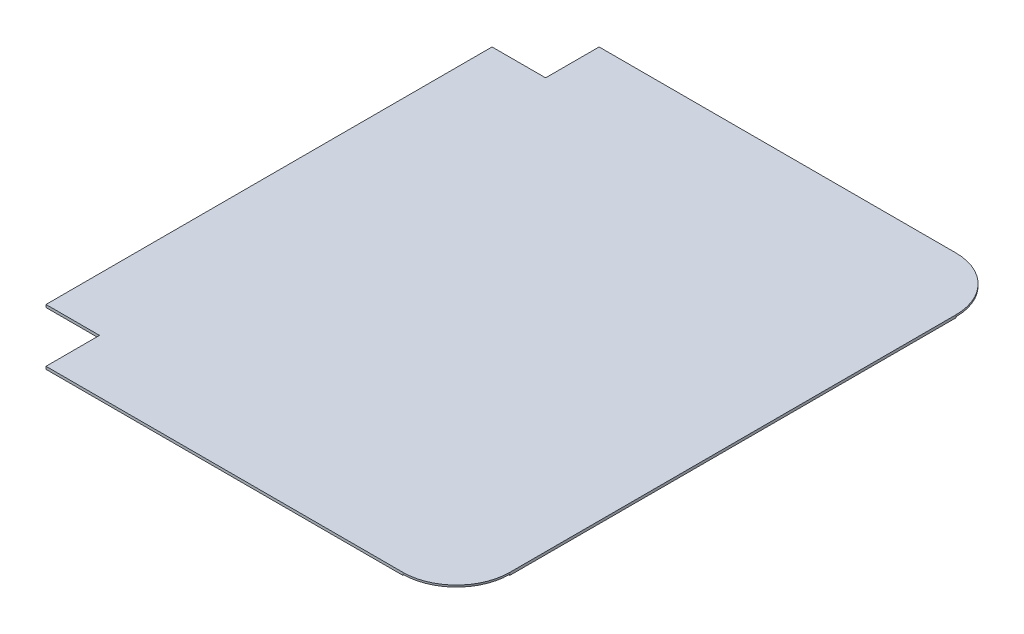
ISO-10303-21;
HEADER;
FILE_DESCRIPTION(('STEP AP214'),'2;1');
FILE_NAME('part.step','',(''),(''),'','','');
FILE_SCHEMA(('AUTOMOTIVE_DESIGN { 1 0 10303 214 1 1 1 1 }'));
ENDSEC;
DATA;
#1=APPLICATION_CONTEXT('core data for automotive mechanical design processes');
#2=APPLICATION_PROTOCOL_DEFINITION('international standard','automotive_design',2000,#1);
#3=PRODUCT_CONTEXT('',#1,'mechanical');
#4=PRODUCT('Part','Part','',(#3));
#5=PRODUCT_RELATED_PRODUCT_CATEGORY('part','',(#4));
#6=PRODUCT_DEFINITION_FORMATION('','',#4);
#7=PRODUCT_DEFINITION_CONTEXT('part definition',#1,'design');
#8=PRODUCT_DEFINITION('design','',#6,#7);
#9=PRODUCT_DEFINITION_SHAPE('','',#8);
#10=(LENGTH_UNIT() NAMED_UNIT(*) SI_UNIT(.MILLI.,.METRE.));
#11=(NAMED_UNIT(*) PLANE_ANGLE_UNIT() SI_UNIT($,.RADIAN.));
#12=(NAMED_UNIT(*) SI_UNIT($,.STERADIAN.) SOLID_ANGLE_UNIT());
#13=UNCERTAINTY_MEASURE_WITH_UNIT(LENGTH_MEASURE(1.E-05),#10,'distance_accuracy_value','');
#14=(GEOMETRIC_REPRESENTATION_CONTEXT(3) GLOBAL_UNCERTAINTY_ASSIGNED_CONTEXT((#13)) GLOBAL_UNIT_ASSIGNED_CONTEXT((#10,
#11,#12)) REPRESENTATION_CONTEXT('',''));
#15=CARTESIAN_POINT('',(0.,0.,0.));
#16=DIRECTION('',(0.,0.,1.));
#17=DIRECTION('',(1.,0.,0.));
#18=AXIS2_PLACEMENT_3D('',#15,#16,#17);
#19=CARTESIAN_POINT('',(159.082568807339,3.,196.788990825688));
#20=DIRECTION('',(-1.,0.,0.));
#21=DIRECTION('',(0.,0.,1.));
#22=AXIS2_PLACEMENT_3D('',#19,#20,#21);
#23=PLANE('',#22);
#24=DIRECTION('',(0.,0.,1.));
#25=VECTOR('',#24,1.);
#26=CARTESIAN_POINT('',(159.082568807339,1.,256.788990825689));
#27=LINE('',#26,#25);
#28=CARTESIAN_POINT('',(159.082568807339,1.,196.788990825689));
#29=VERTEX_POINT('',#28);
#30=CARTESIAN_POINT('',(159.082568807339,1.,256.788990825689));
#31=VERTEX_POINT('',#30);
#32=EDGE_CURVE('E251',#29,#31,#27,.T.);
#33=ORIENTED_EDGE('',*,*,#32,.T.);
#34=DIRECTION('',(0.,-1.,0.));
#35=VECTOR('',#34,1.);
#36=CARTESIAN_POINT('',(159.082568807339,3.,256.788990825688));
#37=LINE('',#36,#35);
#38=CARTESIAN_POINT('',(159.082568807339,0.,256.788990825688));
#39=VERTEX_POINT('',#38);
#40=EDGE_CURVE('E205',#31,#39,#37,.T.);
#41=ORIENTED_EDGE('',*,*,#40,.T.);
#42=DIRECTION('',(0.,0.,-1.));
#43=VECTOR('',#42,1.);
#44=CARTESIAN_POINT('',(159.082568807339,0.,196.788990825688));
#45=LINE('',#44,#43);
#46=CARTESIAN_POINT('',(159.082568807339,0.,196.788990825688));
#47=VERTEX_POINT('',#46);
#48=EDGE_CURVE('E170',#39,#47,#45,.T.);
#49=ORIENTED_EDGE('',*,*,#48,.T.);
#50=DIRECTION('',(0.,-1.,0.));
#51=VECTOR('',#50,1.);
#52=CARTESIAN_POINT('',(159.082568807339,3.,196.788990825688));
#53=LINE('',#52,#51);
#54=EDGE_CURVE('E203',#29,#47,#53,.T.);
#55=ORIENTED_EDGE('',*,*,#54,.F.);
#56=EDGE_LOOP('',(#33,#41,#49,#55));
#57=FACE_BOUND('',#56,.T.);
#58=ADVANCED_FACE('F49',(#57),#23,.F.);
#59=CARTESIAN_POINT('',(219.082568807339,3.,196.788990825688));
#60=DIRECTION('',(0.,0.,-1.));
#61=DIRECTION('',(-1.,0.,0.));
#62=AXIS2_PLACEMENT_3D('',#59,#60,#61);
#63=PLANE('',#62);
#64=DIRECTION('',(-1.,0.,0.));
#65=VECTOR('',#64,1.);
#66=CARTESIAN_POINT('',(159.082568807339,1.,196.788990825689));
#67=LINE('',#66,#65);
#68=CARTESIAN_POINT('',(219.082568807339,1.,196.788990825689));
#69=VERTEX_POINT('',#68);
#70=EDGE_CURVE('E248',#69,#29,#67,.T.);
#71=ORIENTED_EDGE('',*,*,#70,.T.);
#72=ORIENTED_EDGE('',*,*,#54,.T.);
#73=DIRECTION('',(1.,0.,0.));
#74=VECTOR('',#73,1.);
#75=CARTESIAN_POINT('',(219.082568807339,0.,196.788990825688));
#76=LINE('',#75,#74);
#77=CARTESIAN_POINT('',(219.082568807339,0.,196.788990825688));
#78=VERTEX_POINT('',#77);
#79=EDGE_CURVE('E173',#47,#78,#76,.T.);
#80=ORIENTED_EDGE('',*,*,#79,.T.);
#81=DIRECTION('',(0.,-1.,0.));
#82=VECTOR('',#81,1.);
#83=CARTESIAN_POINT('',(219.082568807339,3.,196.788990825688));
#84=LINE('',#83,#82);
#85=EDGE_CURVE('E199',#69,#78,#84,.T.);
#86=ORIENTED_EDGE('',*,*,#85,.F.);
#87=EDGE_LOOP('',(#71,#72,#80,#86));
#88=FACE_BOUND('',#87,.T.);
#89=ADVANCED_FACE('F304',(#88),#63,.F.);
#90=CARTESIAN_POINT('',(-300.917431192661,3.,-303.211009174312));
#91=DIRECTION('',(1.,0.,0.));
#92=DIRECTION('',(0.,0.,-1.));
#93=AXIS2_PLACEMENT_3D('',#90,#91,#92);
#94=PLANE('',#93);
#95=DIRECTION('',(0.,0.,1.));
#96=VECTOR('',#95,1.);
#97=CARTESIAN_POINT('',(-300.917431192661,0.,-303.211009174312));
#98=LINE('',#97,#96);
#99=CARTESIAN_POINT('',(-300.917431192661,0.,-303.211009174312));
#100=VERTEX_POINT('',#99);
#101=CARTESIAN_POINT('',(-300.917431192661,0.,196.788990825688));
#102=VERTEX_POINT('',#101);
#103=EDGE_CURVE('E159',#100,#102,#98,.T.);
#104=ORIENTED_EDGE('',*,*,#103,.T.);
#105=DIRECTION('',(0.,-1.,0.));
#106=VECTOR('',#105,1.);
#107=CARTESIAN_POINT('',(-300.917431192661,3.,196.788990825688));
#108=LINE('',#107,#106);
#109=CARTESIAN_POINT('',(-300.917431192661,3.,196.788990825688));
#110=VERTEX_POINT('',#109);
#111=EDGE_CURVE('E11',#110,#102,#108,.T.);
#112=ORIENTED_EDGE('',*,*,#111,.F.);
#113=DIRECTION('',(0.,0.,1.));
#114=VECTOR('',#113,1.);
#115=CARTESIAN_POINT('',(-300.917431192661,3.,-303.211009174312));
#116=LINE('',#115,#114);
#117=CARTESIAN_POINT('',(-300.917431192661,3.,-303.211009174312));
#118=VERTEX_POINT('',#117);
#119=EDGE_CURVE('E188',#118,#110,#116,.T.);
#120=ORIENTED_EDGE('',*,*,#119,.F.);
#121=DIRECTION('',(0.,-1.,0.));
#122=VECTOR('',#121,1.);
#123=CARTESIAN_POINT('',(-300.917431192661,3.,-303.211009174312));
#124=LINE('',#123,#122);
#125=EDGE_CURVE('E155',#118,#100,#124,.T.);
#126=ORIENTED_EDGE('',*,*,#125,.T.);
#127=EDGE_LOOP('',(#104,#112,#120,#126));
#128=FACE_BOUND('',#127,.T.);
#129=ADVANCED_FACE('F51',(#128),#94,.F.);
#130=CARTESIAN_POINT('',(-300.917431192661,3.,196.788990825688));
#131=DIRECTION('',(0.,0.,-1.));
#132=DIRECTION('',(-1.,0.,0.));
#133=AXIS2_PLACEMENT_3D('',#130,#131,#132);
#134=PLANE('',#133);
#135=DIRECTION('',(1.,0.,0.));
#136=VECTOR('',#135,1.);
#137=CARTESIAN_POINT('',(-300.917431192661,0.,196.788990825688));
#138=LINE('',#137,#136);
#139=CARTESIAN_POINT('',(-240.917431192661,0.,196.788990825688));
#140=VERTEX_POINT('',#139);
#141=EDGE_CURVE('E162',#102,#140,#138,.T.);
#142=ORIENTED_EDGE('',*,*,#141,.T.);
#143=DIRECTION('',(0.,-1.,0.));
#144=VECTOR('',#143,1.);
#145=CARTESIAN_POINT('',(-240.917431192661,3.,196.788990825688));
#146=LINE('',#145,#144);
#147=CARTESIAN_POINT('',(-240.917431192661,3.,196.788990825688));
#148=VERTEX_POINT('',#147);
#149=EDGE_CURVE('E58',#148,#140,#146,.T.);
#150=ORIENTED_EDGE('',*,*,#149,.F.);
#151=DIRECTION('',(1.,0.,0.));
#152=VECTOR('',#151,1.);
#153=CARTESIAN_POINT('',(-300.917431192661,3.,196.788990825688));
#154=LINE('',#153,#152);
#155=EDGE_CURVE('E122',#110,#148,#154,.T.);
#156=ORIENTED_EDGE('',*,*,#155,.F.);
#157=ORIENTED_EDGE('',*,*,#111,.T.);
#158=EDGE_LOOP('',(#142,#150,#156,#157));
#159=FACE_BOUND('',#158,.T.);
#160=ADVANCED_FACE('F332',(#159),#134,.F.);
#161=CARTESIAN_POINT('',(-240.917431192661,3.,196.788990825688));
#162=DIRECTION('',(1.,0.,0.));
#163=DIRECTION('',(0.,0.,-1.));
#164=AXIS2_PLACEMENT_3D('',#161,#162,#163);
#165=PLANE('',#164);
#166=DIRECTION('',(0.,0.,1.));
#167=VECTOR('',#166,1.);
#168=CARTESIAN_POINT('',(-240.917431192661,0.,196.788990825688));
#169=LINE('',#168,#167);
#170=CARTESIAN_POINT('',(-240.917431192661,0.,256.788990825688));
#171=VERTEX_POINT('',#170);
#172=EDGE_CURVE('E165',#140,#171,#169,.T.);
#173=ORIENTED_EDGE('',*,*,#172,.T.);
#174=DIRECTION('',(0.,-1.,0.));
#175=VECTOR('',#174,1.);
#176=CARTESIAN_POINT('',(-240.917431192661,3.,256.788990825688));
#177=LINE('',#176,#175);
#178=CARTESIAN_POINT('',(-240.917431192661,3.,256.788990825688));
#179=VERTEX_POINT('',#178);
#180=EDGE_CURVE('E209',#179,#171,#177,.T.);
#181=ORIENTED_EDGE('',*,*,#180,.F.);
#182=DIRECTION('',(0.,0.,1.));
#183=VECTOR('',#182,1.);
#184=CARTESIAN_POINT('',(-240.917431192661,3.,196.788990825688));
#185=LINE('',#184,#183);
#186=EDGE_CURVE('E217',#148,#179,#185,.T.);
#187=ORIENTED_EDGE('',*,*,#186,.F.);
#188=ORIENTED_EDGE('',*,*,#149,.T.);
#189=EDGE_LOOP('',(#173,#181,#187,#188));
#190=FACE_BOUND('',#189,.T.);
#191=ADVANCED_FACE('F215',(#190),#165,.F.);
#192=CARTESIAN_POINT('',(-240.917431192661,3.,256.788990825688));
#193=DIRECTION('',(0.,0.,-1.));
#194=DIRECTION('',(-1.,0.,0.));
#195=AXIS2_PLACEMENT_3D('',#192,#193,#194);
#196=PLANE('',#195);
#197=DIRECTION('',(1.,0.,0.));
#198=VECTOR('',#197,1.);
#199=CARTESIAN_POINT('',(-240.917431192661,0.,256.788990825688));
#200=LINE('',#199,#198);
#201=EDGE_CURVE('E167',#171,#39,#200,.T.);
#202=ORIENTED_EDGE('',*,*,#201,.T.);
#203=ORIENTED_EDGE('',*,*,#40,.F.);
#204=CARTESIAN_POINT('',(159.082568807339,3.,256.788990825689));
#205=VERTEX_POINT('',#204);
#206=EDGE_CURVE('E206',#205,#31,#37,.T.);
#207=ORIENTED_EDGE('',*,*,#206,.F.);
#208=DIRECTION('',(1.,0.,0.));
#209=VECTOR('',#208,1.);
#210=CARTESIAN_POINT('',(-240.917431192661,3.,256.788990825688));
#211=LINE('',#210,#209);
#212=EDGE_CURVE('E231',#179,#205,#211,.T.);
#213=ORIENTED_EDGE('',*,*,#212,.F.);
#214=ORIENTED_EDGE('',*,*,#180,.T.);
#215=EDGE_LOOP('',(#202,#203,#207,#213,#214));
#216=FACE_BOUND('',#215,.T.);
#217=ADVANCED_FACE('F226',(#216),#196,.F.);
#218=CARTESIAN_POINT('',(219.082568807339,3.,-303.211009174311));
#219=DIRECTION('',(-1.,0.,0.));
#220=DIRECTION('',(0.,0.,1.));
#221=AXIS2_PLACEMENT_3D('',#218,#219,#220);
#222=PLANE('',#221);
#223=DIRECTION('',(0.,0.,-1.));
#224=VECTOR('',#223,1.);
#225=CARTESIAN_POINT('',(219.082568807339,0.,-303.211009174311));
#226=LINE('',#225,#224);
#227=CARTESIAN_POINT('',(219.082568807339,0.,-303.211009174311));
#228=VERTEX_POINT('',#227);
#229=EDGE_CURVE('E176',#78,#228,#226,.T.);
#230=ORIENTED_EDGE('',*,*,#229,.T.);
#231=DIRECTION('',(0.,-1.,0.));
#232=VECTOR('',#231,1.);
#233=CARTESIAN_POINT('',(219.082568807339,3.,-303.211009174311));
#234=LINE('',#233,#232);
#235=CARTESIAN_POINT('',(219.082568807339,1.,-303.211009174312));
#236=VERTEX_POINT('',#235);
#237=EDGE_CURVE('E195',#236,#228,#234,.T.);
#238=ORIENTED_EDGE('',*,*,#237,.F.);
#239=CARTESIAN_POINT('',(219.082568807339,3.,-303.211009174312));
#240=VERTEX_POINT('',#239);
#241=EDGE_CURVE('E196',#240,#236,#234,.T.);
#242=ORIENTED_EDGE('',*,*,#241,.F.);
#243=DIRECTION('',(0.,0.,-1.));
#244=VECTOR('',#243,1.);
#245=CARTESIAN_POINT('',(219.082568807339,3.,-303.211009174311));
#246=LINE('',#245,#244);
#247=CARTESIAN_POINT('',(219.082568807339,3.,196.788990825689));
#248=VERTEX_POINT('',#247);
#249=EDGE_CURVE('E144',#248,#240,#246,.T.);
#250=ORIENTED_EDGE('',*,*,#249,.F.);
#251=EDGE_CURVE('E200',#248,#69,#84,.T.);
#252=ORIENTED_EDGE('',*,*,#251,.T.);
#253=ORIENTED_EDGE('',*,*,#85,.T.);
#254=EDGE_LOOP('',(#230,#238,#242,#250,#252,#253));
#255=FACE_BOUND('',#254,.T.);
#256=ADVANCED_FACE('F267',(#255),#222,.F.);
#257=CARTESIAN_POINT('',(159.082568807339,3.,-303.211009174312));
#258=DIRECTION('',(0.,0.,1.));
#259=DIRECTION('',(1.,0.,0.));
#260=AXIS2_PLACEMENT_3D('',#257,#258,#259);
#261=PLANE('',#260);
#262=DIRECTION('',(0.,-1.,0.));
#263=VECTOR('',#262,1.);
#264=CARTESIAN_POINT('',(159.082568807339,3.,-303.211009174312));
#265=LINE('',#264,#263);
#266=CARTESIAN_POINT('',(159.082568807339,1.,-303.211009174312));
#267=VERTEX_POINT('',#266);
#268=CARTESIAN_POINT('',(159.082568807339,0.,-303.211009174312));
#269=VERTEX_POINT('',#268);
#270=EDGE_CURVE('E193',#267,#269,#265,.T.);
#271=ORIENTED_EDGE('',*,*,#270,.F.);
#272=DIRECTION('',(1.,0.,0.));
#273=VECTOR('',#272,1.);
#274=CARTESIAN_POINT('',(159.082568807339,1.,-303.211009174312));
#275=LINE('',#274,#273);
#276=EDGE_CURVE('E243',#267,#236,#275,.T.);
#277=ORIENTED_EDGE('',*,*,#276,.T.);
#278=ORIENTED_EDGE('',*,*,#237,.T.);
#279=DIRECTION('',(-1.,0.,0.));
#280=VECTOR('',#279,1.);
#281=CARTESIAN_POINT('',(159.082568807339,0.,-303.211009174312));
#282=LINE('',#281,#280);
#283=EDGE_CURVE('E179',#228,#269,#282,.T.);
#284=ORIENTED_EDGE('',*,*,#283,.T.);
#285=EDGE_LOOP('',(#271,#277,#278,#284));
#286=FACE_BOUND('',#285,.T.);
#287=ADVANCED_FACE('F284',(#286),#261,.F.);
#288=CARTESIAN_POINT('',(159.082568807339,3.,-363.211009174312));
#289=DIRECTION('',(-1.,0.,0.));
#290=DIRECTION('',(0.,0.,1.));
#291=AXIS2_PLACEMENT_3D('',#288,#289,#290);
#292=PLANE('',#291);
#293=DIRECTION('',(0.,-1.,0.));
#294=VECTOR('',#293,1.);
#295=CARTESIAN_POINT('',(159.082568807339,3.,-363.211009174312));
#296=LINE('',#295,#294);
#297=CARTESIAN_POINT('',(159.082568807339,1.,-363.211009174312));
#298=VERTEX_POINT('',#297);
#299=CARTESIAN_POINT('',(159.082568807339,0.,-363.211009174312));
#300=VERTEX_POINT('',#299);
#301=EDGE_CURVE('E150',#298,#300,#296,.T.);
#302=ORIENTED_EDGE('',*,*,#301,.F.);
#303=DIRECTION('',(0.,0.,1.));
#304=VECTOR('',#303,1.);
#305=CARTESIAN_POINT('',(159.082568807339,1.,-363.211009174312));
#306=LINE('',#305,#304);
#307=EDGE_CURVE('E239',#298,#267,#306,.T.);
#308=ORIENTED_EDGE('',*,*,#307,.T.);
#309=ORIENTED_EDGE('',*,*,#270,.T.);
#310=DIRECTION('',(0.,0.,-1.));
#311=VECTOR('',#310,1.);
#312=CARTESIAN_POINT('',(159.082568807339,0.,-363.211009174312));
#313=LINE('',#312,#311);
#314=EDGE_CURVE('E182',#269,#300,#313,.T.);
#315=ORIENTED_EDGE('',*,*,#314,.T.);
#316=EDGE_LOOP('',(#302,#308,#309,#315));
#317=FACE_BOUND('',#316,.T.);
#318=ADVANCED_FACE('F289',(#317),#292,.F.);
#319=CARTESIAN_POINT('',(-240.917431192661,3.,-363.211009174312));
#320=DIRECTION('',(0.,0.,1.));
#321=DIRECTION('',(1.,0.,0.));
#322=AXIS2_PLACEMENT_3D('',#319,#320,#321);
#323=PLANE('',#322);
#324=DIRECTION('',(-1.,0.,0.));
#325=VECTOR('',#324,1.);
#326=CARTESIAN_POINT('',(-240.917431192661,0.,-363.211009174312));
#327=LINE('',#326,#325);
#328=CARTESIAN_POINT('',(-240.917431192661,0.,-363.211009174312));
#329=VERTEX_POINT('',#328);
#330=EDGE_CURVE('E149',#300,#329,#327,.T.);
#331=ORIENTED_EDGE('',*,*,#330,.T.);
#332=DIRECTION('',(0.,-1.,0.));
#333=VECTOR('',#332,1.);
#334=CARTESIAN_POINT('',(-240.917431192661,3.,-363.211009174312));
#335=LINE('',#334,#333);
#336=CARTESIAN_POINT('',(-240.917431192661,3.,-363.211009174312));
#337=VERTEX_POINT('',#336);
#338=EDGE_CURVE('E146',#337,#329,#335,.T.);
#339=ORIENTED_EDGE('',*,*,#338,.F.);
#340=DIRECTION('',(-1.,0.,0.));
#341=VECTOR('',#340,1.);
#342=CARTESIAN_POINT('',(-240.917431192661,3.,-363.211009174312));
#343=LINE('',#342,#341);
#344=CARTESIAN_POINT('',(159.082568807339,3.,-363.211009174312));
#345=VERTEX_POINT('',#344);
#346=EDGE_CURVE('E133',#345,#337,#343,.T.);
#347=ORIENTED_EDGE('',*,*,#346,.F.);
#348=EDGE_CURVE('E191',#345,#298,#296,.T.);
#349=ORIENTED_EDGE('',*,*,#348,.T.);
#350=ORIENTED_EDGE('',*,*,#301,.T.);
#351=EDGE_LOOP('',(#331,#339,#347,#349,#350));
#352=FACE_BOUND('',#351,.T.);
#353=ADVANCED_FACE('F147',(#352),#323,.F.);
#354=CARTESIAN_POINT('',(-240.917431192661,3.,-363.211009174312));
#355=DIRECTION('',(1.,0.,0.));
#356=DIRECTION('',(0.,0.,-1.));
#357=AXIS2_PLACEMENT_3D('',#354,#355,#356);
#358=PLANE('',#357);
#359=DIRECTION('',(0.,0.,1.));
#360=VECTOR('',#359,1.);
#361=CARTESIAN_POINT('',(-240.917431192661,0.,-363.211009174312));
#362=LINE('',#361,#360);
#363=CARTESIAN_POINT('',(-240.917431192661,0.,-303.211009174312));
#364=VERTEX_POINT('',#363);
#365=EDGE_CURVE('E108',#329,#364,#362,.T.);
#366=ORIENTED_EDGE('',*,*,#365,.T.);
#367=DIRECTION('',(0.,-1.,0.));
#368=VECTOR('',#367,1.);
#369=CARTESIAN_POINT('',(-240.917431192661,3.,-303.211009174312));
#370=LINE('',#369,#368);
#371=CARTESIAN_POINT('',(-240.917431192661,3.,-303.211009174312));
#372=VERTEX_POINT('',#371);
#373=EDGE_CURVE('E151',#372,#364,#370,.T.);
#374=ORIENTED_EDGE('',*,*,#373,.F.);
#375=DIRECTION('',(0.,0.,1.));
#376=VECTOR('',#375,1.);
#377=CARTESIAN_POINT('',(-240.917431192661,3.,-363.211009174312));
#378=LINE('',#377,#376);
#379=EDGE_CURVE('E138',#337,#372,#378,.T.);
#380=ORIENTED_EDGE('',*,*,#379,.F.);
#381=ORIENTED_EDGE('',*,*,#338,.T.);
#382=EDGE_LOOP('',(#366,#374,#380,#381));
#383=FACE_BOUND('',#382,.T.);
#384=ADVANCED_FACE('F153',(#383),#358,.F.);
#385=CARTESIAN_POINT('',(-300.917431192661,3.,-303.211009174312));
#386=DIRECTION('',(0.,0.,1.));
#387=DIRECTION('',(1.,0.,0.));
#388=AXIS2_PLACEMENT_3D('',#385,#386,#387);
#389=PLANE('',#388);
#390=DIRECTION('',(-1.,0.,0.));
#391=VECTOR('',#390,1.);
#392=CARTESIAN_POINT('',(-300.917431192661,0.,-303.211009174312));
#393=LINE('',#392,#391);
#394=EDGE_CURVE('E114',#364,#100,#393,.T.);
#395=ORIENTED_EDGE('',*,*,#394,.T.);
#396=ORIENTED_EDGE('',*,*,#125,.F.);
#397=DIRECTION('',(-1.,0.,0.));
#398=VECTOR('',#397,1.);
#399=CARTESIAN_POINT('',(-300.917431192661,3.,-303.211009174312));
#400=LINE('',#399,#398);
#401=EDGE_CURVE('E66',#372,#118,#400,.T.);
#402=ORIENTED_EDGE('',*,*,#401,.F.);
#403=ORIENTED_EDGE('',*,*,#373,.T.);
#404=EDGE_LOOP('',(#395,#396,#402,#403));
#405=FACE_BOUND('',#404,.T.);
#406=ADVANCED_FACE('F309',(#405),#389,.F.);
#407=CARTESIAN_POINT('',(0.,3.,0.));
#408=DIRECTION('',(0.,1.,0.));
#409=DIRECTION('',(0.,0.,1.));
#410=AXIS2_PLACEMENT_3D('',#407,#408,#409);
#411=PLANE('',#410);
#412=CARTESIAN_POINT('',(159.082568807339,3.,196.788990825689));
#413=DIRECTION('',(0.,1.,0.));
#414=DIRECTION('',(0.,0.,1.));
#415=AXIS2_PLACEMENT_3D('',#412,#413,#414);
#416=CIRCLE('',#415,59.9999999999999);
#417=EDGE_CURVE('E240',#205,#248,#416,.T.);
#418=ORIENTED_EDGE('',*,*,#417,.T.);
#419=ORIENTED_EDGE('',*,*,#249,.T.);
#420=CARTESIAN_POINT('',(159.082568807339,3.,-303.211009174312));
#421=DIRECTION('',(0.,1.,0.));
#422=DIRECTION('',(0.,0.,-1.));
#423=AXIS2_PLACEMENT_3D('',#420,#421,#422);
#424=CIRCLE('',#423,59.9999999999999);
#425=EDGE_CURVE('E141',#240,#345,#424,.T.);
#426=ORIENTED_EDGE('',*,*,#425,.T.);
#427=ORIENTED_EDGE('',*,*,#346,.T.);
#428=ORIENTED_EDGE('',*,*,#379,.T.);
#429=ORIENTED_EDGE('',*,*,#401,.T.);
#430=ORIENTED_EDGE('',*,*,#119,.T.);
#431=ORIENTED_EDGE('',*,*,#155,.T.);
#432=ORIENTED_EDGE('',*,*,#186,.T.);
#433=ORIENTED_EDGE('',*,*,#212,.T.);
#434=EDGE_LOOP('',(#418,#419,#426,#427,#428,#429,#430,#431,#432,#433));
#435=FACE_BOUND('',#434,.T.);
#436=ADVANCED_FACE('F136',(#435),#411,.T.);
#437=CARTESIAN_POINT('',(0.,0.,0.));
#438=DIRECTION('',(0.,1.,0.));
#439=DIRECTION('',(0.,0.,1.));
#440=AXIS2_PLACEMENT_3D('',#437,#438,#439);
#441=PLANE('',#440);
#442=ORIENTED_EDGE('',*,*,#103,.F.);
#443=ORIENTED_EDGE('',*,*,#394,.F.);
#444=ORIENTED_EDGE('',*,*,#365,.F.);
#445=ORIENTED_EDGE('',*,*,#330,.F.);
#446=ORIENTED_EDGE('',*,*,#314,.F.);
#447=ORIENTED_EDGE('',*,*,#283,.F.);
#448=ORIENTED_EDGE('',*,*,#229,.F.);
#449=ORIENTED_EDGE('',*,*,#79,.F.);
#450=ORIENTED_EDGE('',*,*,#48,.F.);
#451=ORIENTED_EDGE('',*,*,#201,.F.);
#452=ORIENTED_EDGE('',*,*,#172,.F.);
#453=ORIENTED_EDGE('',*,*,#141,.F.);
#454=EDGE_LOOP('',(#442,#443,#444,#445,#446,#447,#448,#449,#450,#451,#452,#453));
#455=FACE_BOUND('',#454,.T.);
#456=ADVANCED_FACE('F221',(#455),#441,.F.);
#457=CARTESIAN_POINT('',(159.082568807339,1.,-303.211009174312));
#458=DIRECTION('',(0.,1.,0.));
#459=DIRECTION('',(0.,0.,1.));
#460=AXIS2_PLACEMENT_3D('',#457,#458,#459);
#461=CYLINDRICAL_SURFACE('',#460,59.9999999999999);
#462=ORIENTED_EDGE('',*,*,#425,.F.);
#463=ORIENTED_EDGE('',*,*,#241,.T.);
#464=CARTESIAN_POINT('',(159.082568807339,1.,-303.211009174312));
#465=DIRECTION('',(0.,1.,0.));
#466=DIRECTION('',(0.,0.,-1.));
#467=AXIS2_PLACEMENT_3D('',#464,#465,#466);
#468=CIRCLE('',#467,59.9999999999999);
#469=EDGE_CURVE('E163',#236,#298,#468,.T.);
#470=ORIENTED_EDGE('',*,*,#469,.T.);
#471=ORIENTED_EDGE('',*,*,#348,.F.);
#472=EDGE_LOOP('',(#462,#463,#470,#471));
#473=FACE_BOUND('',#472,.T.);
#474=ADVANCED_FACE('F273',(#473),#461,.T.);
#475=CARTESIAN_POINT('',(159.082568807339,1.,-303.211009174312));
#476=DIRECTION('',(0.,-1.,0.));
#477=DIRECTION('',(0.,0.,-1.));
#478=AXIS2_PLACEMENT_3D('',#475,#476,#477);
#479=PLANE('',#478);
#480=ORIENTED_EDGE('',*,*,#307,.F.);
#481=ORIENTED_EDGE('',*,*,#469,.F.);
#482=ORIENTED_EDGE('',*,*,#276,.F.);
#483=EDGE_LOOP('',(#480,#481,#482));
#484=FACE_BOUND('',#483,.T.);
#485=ADVANCED_FACE('F281',(#484),#479,.T.);
#486=CARTESIAN_POINT('',(159.082568807339,1.,196.788990825689));
#487=DIRECTION('',(0.,1.,0.));
#488=DIRECTION('',(0.,0.,1.));
#489=AXIS2_PLACEMENT_3D('',#486,#487,#488);
#490=CYLINDRICAL_SURFACE('',#489,59.9999999999999);
#491=ORIENTED_EDGE('',*,*,#417,.F.);
#492=ORIENTED_EDGE('',*,*,#206,.T.);
#493=CARTESIAN_POINT('',(159.082568807339,1.,196.788990825689));
#494=DIRECTION('',(0.,1.,0.));
#495=DIRECTION('',(0.,0.,1.));
#496=AXIS2_PLACEMENT_3D('',#493,#494,#495);
#497=CIRCLE('',#496,59.9999999999999);
#498=EDGE_CURVE('E254',#31,#69,#497,.T.);
#499=ORIENTED_EDGE('',*,*,#498,.T.);
#500=ORIENTED_EDGE('',*,*,#251,.F.);
#501=EDGE_LOOP('',(#491,#492,#499,#500));
#502=FACE_BOUND('',#501,.T.);
#503=ADVANCED_FACE('F303',(#502),#490,.T.);
#504=CARTESIAN_POINT('',(159.082568807339,1.,196.788990825689));
#505=DIRECTION('',(0.,1.,0.));
#506=DIRECTION('',(0.,0.,1.));
#507=AXIS2_PLACEMENT_3D('',#504,#505,#506);
#508=PLANE('',#507);
#509=ORIENTED_EDGE('',*,*,#70,.F.);
#510=ORIENTED_EDGE('',*,*,#498,.F.);
#511=ORIENTED_EDGE('',*,*,#32,.F.);
#512=EDGE_LOOP('',(#509,#510,#511));
#513=FACE_BOUND('',#512,.T.);
#514=ADVANCED_FACE('F299',(#513),#508,.F.);
#515=CLOSED_SHELL('',(#58,#89,#129,#160,#191,#217,#256,#287,#318,#353,#384,#406,#436,#456,#474,
#485,#503,#514));
#516=MANIFOLD_SOLID_BREP('B2',#515);
#517=ADVANCED_BREP_SHAPE_REPRESENTATION('',(#18,#516),#14);
#518=SHAPE_DEFINITION_REPRESENTATION(#9,#517);
ENDSEC;
END-ISO-10303-21;
